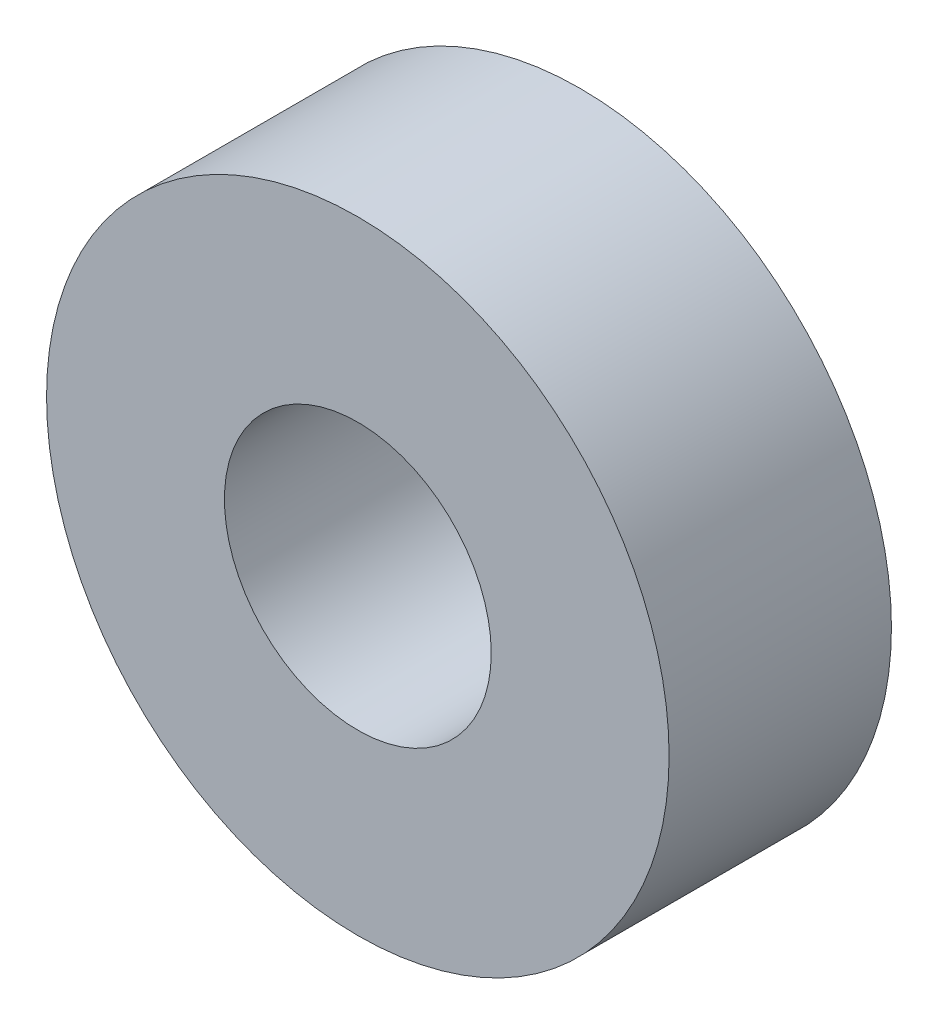
ISO-10303-21;
HEADER;
FILE_DESCRIPTION(('STEP AP214'),'2;1');
FILE_NAME('part.step','',(''),(''),'','','');
FILE_SCHEMA(('AUTOMOTIVE_DESIGN { 1 0 10303 214 1 1 1 1 }'));
ENDSEC;
DATA;
#1=APPLICATION_CONTEXT('core data for automotive mechanical design processes');
#2=APPLICATION_PROTOCOL_DEFINITION('international standard','automotive_design',2000,#1);
#3=PRODUCT_CONTEXT('',#1,'mechanical');
#4=PRODUCT('Part','Part','',(#3));
#5=PRODUCT_RELATED_PRODUCT_CATEGORY('part','',(#4));
#6=PRODUCT_DEFINITION_FORMATION('','',#4);
#7=PRODUCT_DEFINITION_CONTEXT('part definition',#1,'design');
#8=PRODUCT_DEFINITION('design','',#6,#7);
#9=PRODUCT_DEFINITION_SHAPE('','',#8);
#10=(LENGTH_UNIT() NAMED_UNIT(*) SI_UNIT(.MILLI.,.METRE.));
#11=(NAMED_UNIT(*) PLANE_ANGLE_UNIT() SI_UNIT($,.RADIAN.));
#12=(NAMED_UNIT(*) SI_UNIT($,.STERADIAN.) SOLID_ANGLE_UNIT());
#13=UNCERTAINTY_MEASURE_WITH_UNIT(LENGTH_MEASURE(1.E-05),#10,'distance_accuracy_value','');
#14=(GEOMETRIC_REPRESENTATION_CONTEXT(3) GLOBAL_UNCERTAINTY_ASSIGNED_CONTEXT((#13)) GLOBAL_UNIT_ASSIGNED_CONTEXT((#10,
#11,#12)) REPRESENTATION_CONTEXT('',''));
#15=CARTESIAN_POINT('',(0.,0.,0.));
#16=DIRECTION('',(0.,0.,1.));
#17=DIRECTION('',(1.,0.,0.));
#18=AXIS2_PLACEMENT_3D('',#15,#16,#17);
#19=CARTESIAN_POINT('',(0.,0.,5.));
#20=DIRECTION('',(0.,0.,1.));
#21=DIRECTION('',(1.,0.,0.));
#22=AXIS2_PLACEMENT_3D('',#19,#20,#21);
#23=PLANE('',#22);
#24=CARTESIAN_POINT('',(0.,0.,5.));
#25=DIRECTION('',(0.,0.,1.));
#26=DIRECTION('',(1.,0.,0.));
#27=AXIS2_PLACEMENT_3D('',#24,#25,#26);
#28=CIRCLE('',#27,7.);
#29=CARTESIAN_POINT('',(7.,0.,5.));
#30=VERTEX_POINT('',#29);
#31=EDGE_CURVE('E10',#30,#30,#28,.T.);
#32=ORIENTED_EDGE('',*,*,#31,.T.);
#33=EDGE_LOOP('',(#32));
#34=FACE_BOUND('',#33,.T.);
#35=CARTESIAN_POINT('',(0.,0.,5.));
#36=DIRECTION('',(0.,0.,1.));
#37=DIRECTION('',(1.,0.,0.));
#38=AXIS2_PLACEMENT_3D('',#35,#36,#37);
#39=CIRCLE('',#38,3.);
#40=CARTESIAN_POINT('',(3.,0.,5.));
#41=VERTEX_POINT('',#40);
#42=EDGE_CURVE('E41',#41,#41,#39,.T.);
#43=ORIENTED_EDGE('',*,*,#42,.F.);
#44=EDGE_LOOP('',(#43));
#45=FACE_BOUND('',#44,.T.);
#46=ADVANCED_FACE('F30',(#34,#45),#23,.T.);
#47=CARTESIAN_POINT('',(0.,0.,0.));
#48=DIRECTION('',(0.,0.,1.));
#49=DIRECTION('',(1.,0.,0.));
#50=AXIS2_PLACEMENT_3D('',#47,#48,#49);
#51=PLANE('',#50);
#52=CARTESIAN_POINT('',(0.,0.,0.));
#53=DIRECTION('',(0.,0.,1.));
#54=DIRECTION('',(1.,0.,0.));
#55=AXIS2_PLACEMENT_3D('',#52,#53,#54);
#56=CIRCLE('',#55,7.);
#57=CARTESIAN_POINT('',(7.,0.,0.));
#58=VERTEX_POINT('',#57);
#59=EDGE_CURVE('E34',#58,#58,#56,.T.);
#60=ORIENTED_EDGE('',*,*,#59,.F.);
#61=EDGE_LOOP('',(#60));
#62=FACE_BOUND('',#61,.T.);
#63=CARTESIAN_POINT('',(0.,0.,0.));
#64=DIRECTION('',(0.,0.,1.));
#65=DIRECTION('',(1.,0.,0.));
#66=AXIS2_PLACEMENT_3D('',#63,#64,#65);
#67=CIRCLE('',#66,3.);
#68=CARTESIAN_POINT('',(3.,0.,0.));
#69=VERTEX_POINT('',#68);
#70=EDGE_CURVE('E43',#69,#69,#67,.T.);
#71=ORIENTED_EDGE('',*,*,#70,.T.);
#72=EDGE_LOOP('',(#71));
#73=FACE_BOUND('',#72,.T.);
#74=ADVANCED_FACE('F53',(#62,#73),#51,.F.);
#75=CARTESIAN_POINT('',(0.,0.,5.));
#76=DIRECTION('',(0.,0.,-1.));
#77=DIRECTION('',(-1.,0.,0.));
#78=AXIS2_PLACEMENT_3D('',#75,#76,#77);
#79=CYLINDRICAL_SURFACE('',#78,7.);
#80=ORIENTED_EDGE('',*,*,#31,.F.);
#81=EDGE_LOOP('',(#80));
#82=FACE_BOUND('',#81,.T.);
#83=ORIENTED_EDGE('',*,*,#59,.T.);
#84=EDGE_LOOP('',(#83));
#85=FACE_BOUND('',#84,.T.);
#86=ADVANCED_FACE('F32',(#82,#85),#79,.T.);
#87=CARTESIAN_POINT('',(0.,0.,5.));
#88=DIRECTION('',(0.,0.,-1.));
#89=DIRECTION('',(-1.,0.,0.));
#90=AXIS2_PLACEMENT_3D('',#87,#88,#89);
#91=CYLINDRICAL_SURFACE('',#90,3.);
#92=ORIENTED_EDGE('',*,*,#42,.T.);
#93=EDGE_LOOP('',(#92));
#94=FACE_BOUND('',#93,.T.);
#95=ORIENTED_EDGE('',*,*,#70,.F.);
#96=EDGE_LOOP('',(#95));
#97=FACE_BOUND('',#96,.T.);
#98=ADVANCED_FACE('F49',(#94,#97),#91,.F.);
#99=CLOSED_SHELL('',(#46,#74,#86,#98));
#100=MANIFOLD_SOLID_BREP('B2',#99);
#101=ADVANCED_BREP_SHAPE_REPRESENTATION('',(#18,#100),#14);
#102=SHAPE_DEFINITION_REPRESENTATION(#9,#101);
ENDSEC;
END-ISO-10303-21;
